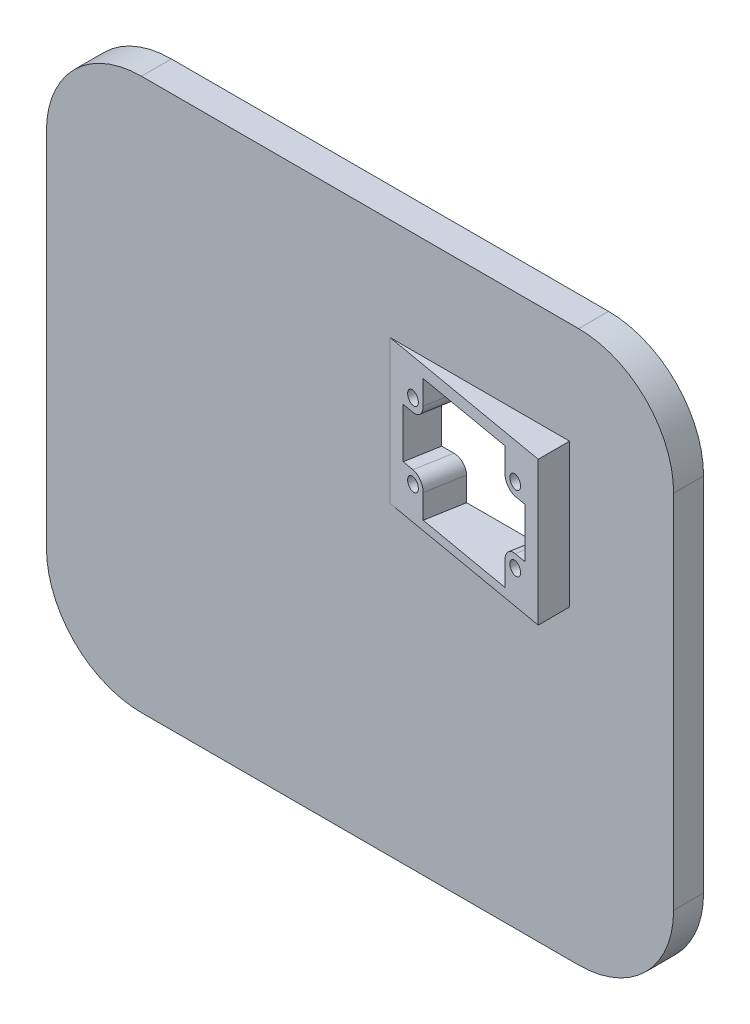
ISO-10303-21;
HEADER;
FILE_DESCRIPTION(('STEP AP214'),'2;1');
FILE_NAME('part.step','',(''),(''),'','','');
FILE_SCHEMA(('AUTOMOTIVE_DESIGN { 1 0 10303 214 1 1 1 1 }'));
ENDSEC;
DATA;
#1=APPLICATION_CONTEXT('core data for automotive mechanical design processes');
#2=APPLICATION_PROTOCOL_DEFINITION('international standard','automotive_design',2000,#1);
#3=PRODUCT_CONTEXT('',#1,'mechanical');
#4=PRODUCT('Part','Part','',(#3));
#5=PRODUCT_RELATED_PRODUCT_CATEGORY('part','',(#4));
#6=PRODUCT_DEFINITION_FORMATION('','',#4);
#7=PRODUCT_DEFINITION_CONTEXT('part definition',#1,'design');
#8=PRODUCT_DEFINITION('design','',#6,#7);
#9=PRODUCT_DEFINITION_SHAPE('','',#8);
#10=(LENGTH_UNIT() NAMED_UNIT(*) SI_UNIT(.MILLI.,.METRE.));
#11=(NAMED_UNIT(*) PLANE_ANGLE_UNIT() SI_UNIT($,.RADIAN.));
#12=(NAMED_UNIT(*) SI_UNIT($,.STERADIAN.) SOLID_ANGLE_UNIT());
#13=UNCERTAINTY_MEASURE_WITH_UNIT(LENGTH_MEASURE(1.E-05),#10,'distance_accuracy_value','');
#14=(GEOMETRIC_REPRESENTATION_CONTEXT(3) GLOBAL_UNCERTAINTY_ASSIGNED_CONTEXT((#13)) GLOBAL_UNIT_ASSIGNED_CONTEXT((#10,
#11,#12)) REPRESENTATION_CONTEXT('',''));
#15=CARTESIAN_POINT('',(0.,0.,0.));
#16=DIRECTION('',(0.,0.,1.));
#17=DIRECTION('',(1.,0.,0.));
#18=AXIS2_PLACEMENT_3D('',#15,#16,#17);
#19=CARTESIAN_POINT('',(-36.5125,30.1625,0.));
#20=DIRECTION('',(0.,0.,1.));
#21=DIRECTION('',(1.,0.,0.));
#22=AXIS2_PLACEMENT_3D('',#19,#20,#21);
#23=PLANE('',#22);
#24=CARTESIAN_POINT('',(31.987168446158,10.5,0.));
#25=DIRECTION('',(0.,0.,1.));
#26=DIRECTION('',(-1.,0.,0.));
#27=AXIS2_PLACEMENT_3D('',#24,#25,#26);
#28=ELLIPSE('',#27,1.1166102666244,1.1);
#29=CARTESIAN_POINT('',(30.8705581795336,10.5,0.));
#30=VERTEX_POINT('',#29);
#31=EDGE_CURVE('E408',#30,#30,#28,.T.);
#32=ORIENTED_EDGE('',*,*,#31,.T.);
#33=EDGE_LOOP('',(#32));
#34=FACE_BOUND('',#33,.T.);
#35=CARTESIAN_POINT('',(10.6700633560558,23.,0.));
#36=DIRECTION('',(0.,0.,1.));
#37=DIRECTION('',(-1.,0.,0.));
#38=AXIS2_PLACEMENT_3D('',#35,#36,#37);
#39=ELLIPSE('',#38,1.1166102666244,1.1);
#40=CARTESIAN_POINT('',(9.55345308943141,23.,0.));
#41=VERTEX_POINT('',#40);
#42=EDGE_CURVE('E400',#41,#41,#39,.T.);
#43=ORIENTED_EDGE('',*,*,#42,.T.);
#44=EDGE_LOOP('',(#43));
#45=FACE_BOUND('',#44,.T.);
#46=CARTESIAN_POINT('',(-36.5125,30.1625,0.));
#47=DIRECTION('',(0.,0.,1.));
#48=DIRECTION('',(1.,0.,0.));
#49=AXIS2_PLACEMENT_3D('',#46,#47,#48);
#50=CIRCLE('',#49,15.875);
#51=CARTESIAN_POINT('',(-36.5125,46.0375,0.));
#52=VERTEX_POINT('',#51);
#53=CARTESIAN_POINT('',(-52.3875,30.1625,0.));
#54=VERTEX_POINT('',#53);
#55=EDGE_CURVE('E448',#52,#54,#50,.T.);
#56=ORIENTED_EDGE('',*,*,#55,.F.);
#57=DIRECTION('',(-1.,0.,0.));
#58=VECTOR('',#57,1.);
#59=CARTESIAN_POINT('',(-36.5125,46.0375,0.));
#60=LINE('',#59,#58);
#61=CARTESIAN_POINT('',(36.5125,46.0375,0.));
#62=VERTEX_POINT('',#61);
#63=EDGE_CURVE('E454',#62,#52,#60,.T.);
#64=ORIENTED_EDGE('',*,*,#63,.F.);
#65=CARTESIAN_POINT('',(36.5125,30.1625,0.));
#66=DIRECTION('',(0.,0.,1.));
#67=DIRECTION('',(-1.,0.,0.));
#68=AXIS2_PLACEMENT_3D('',#65,#66,#67);
#69=CIRCLE('',#68,15.875);
#70=CARTESIAN_POINT('',(52.3875,30.1625,0.));
#71=VERTEX_POINT('',#70);
#72=EDGE_CURVE('E494',#71,#62,#69,.T.);
#73=ORIENTED_EDGE('',*,*,#72,.F.);
#74=DIRECTION('',(0.,1.,0.));
#75=VECTOR('',#74,1.);
#76=CARTESIAN_POINT('',(52.3875,30.1625,0.));
#77=LINE('',#76,#75);
#78=CARTESIAN_POINT('',(52.3875,-30.1625,0.));
#79=VERTEX_POINT('',#78);
#80=EDGE_CURVE('E491',#79,#71,#77,.T.);
#81=ORIENTED_EDGE('',*,*,#80,.F.);
#82=CARTESIAN_POINT('',(36.5125,-30.1625,0.));
#83=DIRECTION('',(0.,0.,1.));
#84=DIRECTION('',(1.,0.,0.));
#85=AXIS2_PLACEMENT_3D('',#82,#83,#84);
#86=CIRCLE('',#85,15.875);
#87=CARTESIAN_POINT('',(36.5125,-46.0375,0.));
#88=VERTEX_POINT('',#87);
#89=EDGE_CURVE('E488',#88,#79,#86,.T.);
#90=ORIENTED_EDGE('',*,*,#89,.F.);
#91=DIRECTION('',(1.,0.,0.));
#92=VECTOR('',#91,1.);
#93=CARTESIAN_POINT('',(-36.5125,-46.0375,0.));
#94=LINE('',#93,#92);
#95=CARTESIAN_POINT('',(-36.5125,-46.0375,0.));
#96=VERTEX_POINT('',#95);
#97=EDGE_CURVE('E485',#96,#88,#94,.T.);
#98=ORIENTED_EDGE('',*,*,#97,.F.);
#99=CARTESIAN_POINT('',(-36.5125,-30.1625,0.));
#100=DIRECTION('',(0.,0.,1.));
#101=DIRECTION('',(-1.,0.,0.));
#102=AXIS2_PLACEMENT_3D('',#99,#100,#101);
#103=CIRCLE('',#102,15.875);
#104=CARTESIAN_POINT('',(-52.3875,-30.1625,0.));
#105=VERTEX_POINT('',#104);
#106=EDGE_CURVE('E482',#105,#96,#103,.T.);
#107=ORIENTED_EDGE('',*,*,#106,.F.);
#108=DIRECTION('',(0.,-1.,0.));
#109=VECTOR('',#108,1.);
#110=CARTESIAN_POINT('',(-52.3875,30.1625,0.));
#111=LINE('',#110,#109);
#112=EDGE_CURVE('E479',#54,#105,#111,.T.);
#113=ORIENTED_EDGE('',*,*,#112,.F.);
#114=EDGE_LOOP('',(#56,#64,#73,#81,#90,#98,#107,#113));
#115=FACE_BOUND('',#114,.T.);
#116=DIRECTION('',(-1.,0.,0.));
#117=VECTOR('',#116,1.);
#118=CARTESIAN_POINT('',(-36.5125,27.,0.));
#119=LINE('',#118,#117);
#120=CARTESIAN_POINT('',(29.8554579371477,27.,0.));
#121=VERTEX_POINT('',#120);
#122=CARTESIAN_POINT('',(12.801773865066,27.,0.));
#123=VERTEX_POINT('',#122);
#124=EDGE_CURVE('E392',#121,#123,#119,.T.);
#125=ORIENTED_EDGE('',*,*,#124,.T.);
#126=DIRECTION('',(0.,-1.,0.));
#127=VECTOR('',#126,1.);
#128=CARTESIAN_POINT('',(12.801773865066,30.1625,0.));
#129=LINE('',#128,#127);
#130=CARTESIAN_POINT('',(12.801773865066,23.,0.));
#131=VERTEX_POINT('',#130);
#132=EDGE_CURVE('E396',#123,#131,#129,.T.);
#133=ORIENTED_EDGE('',*,*,#132,.T.);
#134=CARTESIAN_POINT('',(10.6700633560558,23.,0.));
#135=DIRECTION('',(0.,0.,1.));
#136=DIRECTION('',(-1.,0.,0.));
#137=AXIS2_PLACEMENT_3D('',#134,#135,#136);
#138=ELLIPSE('',#137,2.13171050901021,2.1);
#139=CARTESIAN_POINT('',(10.6700633560558,20.9,0.));
#140=VERTEX_POINT('',#139);
#141=EDGE_CURVE('E299',#131,#140,#138,.F.);
#142=ORIENTED_EDGE('',*,*,#141,.T.);
#143=DIRECTION('',(-1.,0.,0.));
#144=VECTOR('',#143,1.);
#145=CARTESIAN_POINT('',(-36.5125,20.8999999999998,0.));
#146=LINE('',#145,#144);
#147=CARTESIAN_POINT('',(8.63986287128418,20.9,0.));
#148=VERTEX_POINT('',#147);
#149=EDGE_CURVE('E225',#140,#148,#146,.T.);
#150=ORIENTED_EDGE('',*,*,#149,.T.);
#151=DIRECTION('',(0.,-1.,0.));
#152=VECTOR('',#151,1.);
#153=CARTESIAN_POINT('',(8.63986287128418,30.1625,0.));
#154=LINE('',#153,#152);
#155=CARTESIAN_POINT('',(8.63986287128417,12.6,0.));
#156=VERTEX_POINT('',#155);
#157=EDGE_CURVE('E344',#148,#156,#154,.T.);
#158=ORIENTED_EDGE('',*,*,#157,.T.);
#159=DIRECTION('',(1.,0.,0.));
#160=VECTOR('',#159,1.);
#161=CARTESIAN_POINT('',(-36.5125,12.6000000000001,0.));
#162=LINE('',#161,#160);
#163=CARTESIAN_POINT('',(10.6700633560558,12.6,0.));
#164=VERTEX_POINT('',#163);
#165=EDGE_CURVE('E348',#156,#164,#162,.T.);
#166=ORIENTED_EDGE('',*,*,#165,.T.);
#167=CARTESIAN_POINT('',(10.6700633560558,10.5,0.));
#168=DIRECTION('',(0.,0.,1.));
#169=DIRECTION('',(-1.,0.,0.));
#170=AXIS2_PLACEMENT_3D('',#167,#168,#169);
#171=ELLIPSE('',#170,2.13171050901021,2.1);
#172=CARTESIAN_POINT('',(12.801773865066,10.5,0.));
#173=VERTEX_POINT('',#172);
#174=EDGE_CURVE('E352',#164,#173,#171,.F.);
#175=ORIENTED_EDGE('',*,*,#174,.T.);
#176=DIRECTION('',(0.,-1.,0.));
#177=VECTOR('',#176,1.);
#178=CARTESIAN_POINT('',(12.801773865066,30.1625,0.));
#179=LINE('',#178,#177);
#180=CARTESIAN_POINT('',(12.801773865066,6.5,0.));
#181=VERTEX_POINT('',#180);
#182=EDGE_CURVE('E356',#173,#181,#179,.T.);
#183=ORIENTED_EDGE('',*,*,#182,.T.);
#184=DIRECTION('',(1.,0.,0.));
#185=VECTOR('',#184,1.);
#186=CARTESIAN_POINT('',(-36.5125,6.49999999999999,0.));
#187=LINE('',#186,#185);
#188=CARTESIAN_POINT('',(29.8554579371477,6.5,0.));
#189=VERTEX_POINT('',#188);
#190=EDGE_CURVE('E360',#181,#189,#187,.T.);
#191=ORIENTED_EDGE('',*,*,#190,.T.);
#192=DIRECTION('',(0.,1.,0.));
#193=VECTOR('',#192,1.);
#194=CARTESIAN_POINT('',(29.8554579371477,30.1625,0.));
#195=LINE('',#194,#193);
#196=CARTESIAN_POINT('',(29.8554579371477,10.5,0.));
#197=VERTEX_POINT('',#196);
#198=EDGE_CURVE('E364',#189,#197,#195,.T.);
#199=ORIENTED_EDGE('',*,*,#198,.T.);
#200=CARTESIAN_POINT('',(31.987168446158,10.5,0.));
#201=DIRECTION('',(0.,0.,1.));
#202=DIRECTION('',(-1.,0.,0.));
#203=AXIS2_PLACEMENT_3D('',#200,#201,#202);
#204=ELLIPSE('',#203,2.13171050901021,2.1);
#205=CARTESIAN_POINT('',(31.987168446158,12.6,0.));
#206=VERTEX_POINT('',#205);
#207=EDGE_CURVE('E368',#197,#206,#204,.F.);
#208=ORIENTED_EDGE('',*,*,#207,.T.);
#209=DIRECTION('',(1.,0.,0.));
#210=VECTOR('',#209,1.);
#211=CARTESIAN_POINT('',(-36.5124999999999,12.5999999999998,0.));
#212=LINE('',#211,#210);
#213=CARTESIAN_POINT('',(34.0173689309296,12.6,0.));
#214=VERTEX_POINT('',#213);
#215=EDGE_CURVE('E372',#206,#214,#212,.T.);
#216=ORIENTED_EDGE('',*,*,#215,.T.);
#217=DIRECTION('',(0.,1.,0.));
#218=VECTOR('',#217,1.);
#219=CARTESIAN_POINT('',(34.0173689309296,30.1625,0.));
#220=LINE('',#219,#218);
#221=CARTESIAN_POINT('',(34.0173689309296,20.9,0.));
#222=VERTEX_POINT('',#221);
#223=EDGE_CURVE('E376',#214,#222,#220,.T.);
#224=ORIENTED_EDGE('',*,*,#223,.T.);
#225=DIRECTION('',(-1.,0.,0.));
#226=VECTOR('',#225,1.);
#227=CARTESIAN_POINT('',(-36.5125,20.9000000000002,0.));
#228=LINE('',#227,#226);
#229=CARTESIAN_POINT('',(31.987168446158,20.9,0.));
#230=VERTEX_POINT('',#229);
#231=EDGE_CURVE('E380',#222,#230,#228,.T.);
#232=ORIENTED_EDGE('',*,*,#231,.T.);
#233=CARTESIAN_POINT('',(31.987168446158,23.,0.));
#234=DIRECTION('',(0.,0.,1.));
#235=DIRECTION('',(-1.,0.,0.));
#236=AXIS2_PLACEMENT_3D('',#233,#234,#235);
#237=ELLIPSE('',#236,2.13171050901021,2.1);
#238=CARTESIAN_POINT('',(29.8554579371477,23.,0.));
#239=VERTEX_POINT('',#238);
#240=EDGE_CURVE('E384',#230,#239,#237,.F.);
#241=ORIENTED_EDGE('',*,*,#240,.T.);
#242=DIRECTION('',(0.,1.,0.));
#243=VECTOR('',#242,1.);
#244=CARTESIAN_POINT('',(29.8554579371477,30.1625,0.));
#245=LINE('',#244,#243);
#246=EDGE_CURVE('E388',#239,#121,#245,.T.);
#247=ORIENTED_EDGE('',*,*,#246,.T.);
#248=EDGE_LOOP('',(#125,#133,#142,#150,#158,#166,#175,#183,#191,#199,#208,#216,#224,#232,#241,#247));
#249=FACE_BOUND('',#248,.T.);
#250=CARTESIAN_POINT('',(31.987168446158,23.,0.));
#251=DIRECTION('',(0.,0.,1.));
#252=DIRECTION('',(-1.,0.,0.));
#253=AXIS2_PLACEMENT_3D('',#250,#251,#252);
#254=ELLIPSE('',#253,1.1166102666244,1.1);
#255=CARTESIAN_POINT('',(30.8705581795336,23.,0.));
#256=VERTEX_POINT('',#255);
#257=EDGE_CURVE('E404',#256,#256,#254,.T.);
#258=ORIENTED_EDGE('',*,*,#257,.T.);
#259=EDGE_LOOP('',(#258));
#260=FACE_BOUND('',#259,.T.);
#261=CARTESIAN_POINT('',(10.6700633560558,10.5,0.));
#262=DIRECTION('',(0.,0.,1.));
#263=DIRECTION('',(-1.,0.,0.));
#264=AXIS2_PLACEMENT_3D('',#261,#262,#263);
#265=ELLIPSE('',#264,1.1166102666244,1.1);
#266=CARTESIAN_POINT('',(9.55345308943141,10.5,0.));
#267=VERTEX_POINT('',#266);
#268=EDGE_CURVE('E412',#267,#267,#265,.T.);
#269=ORIENTED_EDGE('',*,*,#268,.T.);
#270=EDGE_LOOP('',(#269));
#271=FACE_BOUND('',#270,.T.);
#272=ADVANCED_FACE('F39',(#34,#45,#115,#249,#260,#271),#23,.F.);
#273=CARTESIAN_POINT('',(4.99999999999998,29.,5.));
#274=DIRECTION('',(0.171842805924432,0.,-0.985124383035979));
#275=DIRECTION('',(-0.985124383035979,0.,-0.171842805924432));
#276=AXIS2_PLACEMENT_3D('',#273,#274,#275);
#277=PLANE('',#276);
#278=CARTESIAN_POINT('',(30.3438060218778,10.5,9.42091457139877));
#279=DIRECTION('',(-0.171842805924432,0.,0.985124383035979));
#280=DIRECTION('',(0.985124383035979,0.,0.171842805924432));
#281=AXIS2_PLACEMENT_3D('',#278,#279,#280);
#282=CIRCLE('',#281,1.1);
#283=CARTESIAN_POINT('',(31.4274428432173,10.5,9.60994165791565));
#284=VERTEX_POINT('',#283);
#285=EDGE_CURVE('E690',#284,#284,#282,.T.);
#286=ORIENTED_EDGE('',*,*,#285,.F.);
#287=EDGE_LOOP('',(#286));
#288=FACE_BOUND('',#287,.T.);
#289=CARTESIAN_POINT('',(9.65619397812221,23.,5.81221564698571));
#290=DIRECTION('',(-0.171842805924432,0.,0.985124383035979));
#291=DIRECTION('',(0.985124383035979,0.,0.171842805924432));
#292=AXIS2_PLACEMENT_3D('',#289,#290,#291);
#293=CIRCLE('',#292,1.1);
#294=CARTESIAN_POINT('',(10.7398307994618,23.,6.00124273350259));
#295=VERTEX_POINT('',#294);
#296=EDGE_CURVE('E681',#295,#295,#293,.T.);
#297=ORIENTED_EDGE('',*,*,#296,.F.);
#298=EDGE_LOOP('',(#297));
#299=FACE_BOUND('',#298,.T.);
#300=DIRECTION('',(0.985124383035979,0.,0.171842805924432));
#301=VECTOR('',#300,1.);
#302=CARTESIAN_POINT('',(4.99999999999998,5.,5.));
#303=LINE('',#302,#301);
#304=CARTESIAN_POINT('',(4.99999999999998,5.,5.));
#305=VERTEX_POINT('',#304);
#306=CARTESIAN_POINT('',(35.,5.,10.2331302183845));
#307=VERTEX_POINT('',#306);
#308=EDGE_CURVE('E432',#305,#307,#303,.T.);
#309=ORIENTED_EDGE('',*,*,#308,.T.);
#310=DIRECTION('',(0.,-1.,0.));
#311=VECTOR('',#310,1.);
#312=CARTESIAN_POINT('',(35.,29.,10.2331302183845));
#313=LINE('',#312,#311);
#314=CARTESIAN_POINT('',(35.,29.,10.2331302183845));
#315=VERTEX_POINT('',#314);
#316=EDGE_CURVE('E440',#315,#307,#313,.T.);
#317=ORIENTED_EDGE('',*,*,#316,.F.);
#318=DIRECTION('',(0.985124383035979,0.,0.171842805924432));
#319=VECTOR('',#318,1.);
#320=CARTESIAN_POINT('',(4.99999999999998,29.,5.));
#321=LINE('',#320,#319);
#322=CARTESIAN_POINT('',(4.99999999999998,29.,5.));
#323=VERTEX_POINT('',#322);
#324=EDGE_CURVE('E421',#323,#315,#321,.T.);
#325=ORIENTED_EDGE('',*,*,#324,.F.);
#326=DIRECTION('',(0.,-1.,0.));
#327=VECTOR('',#326,1.);
#328=CARTESIAN_POINT('',(4.99999999999998,29.,5.));
#329=LINE('',#328,#327);
#330=EDGE_CURVE('E444',#323,#305,#329,.T.);
#331=ORIENTED_EDGE('',*,*,#330,.T.);
#332=EDGE_LOOP('',(#309,#317,#325,#331));
#333=FACE_BOUND('',#332,.T.);
#334=CARTESIAN_POINT('',(9.65619397812221,23.,5.81221564698571));
#335=DIRECTION('',(0.171842805924432,0.,-0.985124383035979));
#336=DIRECTION('',(0.985124383035979,0.,0.171842805924432));
#337=AXIS2_PLACEMENT_3D('',#334,#335,#336);
#338=CIRCLE('',#337,2.1);
#339=CARTESIAN_POINT('',(11.7249551824978,23.,6.17308553942701));
#340=VERTEX_POINT('',#339);
#341=CARTESIAN_POINT('',(9.65619397812221,20.9,5.81221564698571));
#342=VERTEX_POINT('',#341);
#343=EDGE_CURVE('E232',#340,#342,#338,.T.);
#344=ORIENTED_EDGE('',*,*,#343,.F.);
#345=DIRECTION('',(0.,-1.,0.));
#346=VECTOR('',#345,1.);
#347=CARTESIAN_POINT('',(11.7249551824978,27.,6.17308553942702));
#348=LINE('',#347,#346);
#349=CARTESIAN_POINT('',(11.7249551824978,27.,6.17308553942702));
#350=VERTEX_POINT('',#349);
#351=EDGE_CURVE('E63',#350,#340,#348,.T.);
#352=ORIENTED_EDGE('',*,*,#351,.F.);
#353=DIRECTION('',(-0.985124383035979,0.,-0.171842805924431));
#354=VECTOR('',#353,1.);
#355=CARTESIAN_POINT('',(28.2750448175022,27.,9.06004467895747));
#356=LINE('',#355,#354);
#357=CARTESIAN_POINT('',(28.2750448175022,27.,9.06004467895747));
#358=VERTEX_POINT('',#357);
#359=EDGE_CURVE('E292',#358,#350,#356,.T.);
#360=ORIENTED_EDGE('',*,*,#359,.F.);
#361=DIRECTION('',(0.,1.,0.));
#362=VECTOR('',#361,1.);
#363=CARTESIAN_POINT('',(28.2750448175022,27.,9.06004467895747));
#364=LINE('',#363,#362);
#365=CARTESIAN_POINT('',(28.2750448175022,23.,9.06004467895747));
#366=VERTEX_POINT('',#365);
#367=EDGE_CURVE('E288',#366,#358,#364,.T.);
#368=ORIENTED_EDGE('',*,*,#367,.F.);
#369=CARTESIAN_POINT('',(30.3438060218778,23.,9.42091457139877));
#370=DIRECTION('',(0.171842805924432,0.,-0.985124383035979));
#371=DIRECTION('',(-0.985124383035979,0.,-0.171842805924432));
#372=AXIS2_PLACEMENT_3D('',#369,#370,#371);
#373=CIRCLE('',#372,2.1);
#374=CARTESIAN_POINT('',(30.3438060218778,20.9,9.42091457139878));
#375=VERTEX_POINT('',#374);
#376=EDGE_CURVE('E284',#375,#366,#373,.T.);
#377=ORIENTED_EDGE('',*,*,#376,.F.);
#378=DIRECTION('',(-0.985124383035979,0.,-0.171842805924432));
#379=VECTOR('',#378,1.);
#380=CARTESIAN_POINT('',(32.3140547879497,20.9,9.76460018324764));
#381=LINE('',#380,#379);
#382=CARTESIAN_POINT('',(32.3140547879497,20.9,9.76460018324764));
#383=VERTEX_POINT('',#382);
#384=EDGE_CURVE('E280',#383,#375,#381,.T.);
#385=ORIENTED_EDGE('',*,*,#384,.F.);
#386=DIRECTION('',(0.,1.,0.));
#387=VECTOR('',#386,1.);
#388=CARTESIAN_POINT('',(32.3140547879497,20.9,9.76460018324764));
#389=LINE('',#388,#387);
#390=CARTESIAN_POINT('',(32.3140547879497,12.6,9.76460018324764));
#391=VERTEX_POINT('',#390);
#392=EDGE_CURVE('E276',#391,#383,#389,.T.);
#393=ORIENTED_EDGE('',*,*,#392,.F.);
#394=DIRECTION('',(0.985124383035979,0.,0.171842805924432));
#395=VECTOR('',#394,1.);
#396=CARTESIAN_POINT('',(32.3140547879497,12.6,9.76460018324764));
#397=LINE('',#396,#395);
#398=CARTESIAN_POINT('',(30.3438060218778,12.6,9.42091457139878));
#399=VERTEX_POINT('',#398);
#400=EDGE_CURVE('E272',#399,#391,#397,.T.);
#401=ORIENTED_EDGE('',*,*,#400,.F.);
#402=CARTESIAN_POINT('',(30.3438060218778,10.5,9.42091457139877));
#403=DIRECTION('',(0.171842805924432,0.,-0.985124383035979));
#404=DIRECTION('',(0.985124383035979,0.,0.171842805924432));
#405=AXIS2_PLACEMENT_3D('',#402,#403,#404);
#406=CIRCLE('',#405,2.1);
#407=CARTESIAN_POINT('',(28.2750448175022,10.5,9.06004467895747));
#408=VERTEX_POINT('',#407);
#409=EDGE_CURVE('E268',#408,#399,#406,.T.);
#410=ORIENTED_EDGE('',*,*,#409,.F.);
#411=DIRECTION('',(0.,1.,0.));
#412=VECTOR('',#411,1.);
#413=CARTESIAN_POINT('',(28.2750448175022,6.5,9.06004467895747));
#414=LINE('',#413,#412);
#415=CARTESIAN_POINT('',(28.2750448175022,6.5,9.06004467895747));
#416=VERTEX_POINT('',#415);
#417=EDGE_CURVE('E264',#416,#408,#414,.T.);
#418=ORIENTED_EDGE('',*,*,#417,.F.);
#419=DIRECTION('',(0.985124383035979,0.,0.171842805924432));
#420=VECTOR('',#419,1.);
#421=CARTESIAN_POINT('',(28.2750448175022,6.5,9.06004467895747));
#422=LINE('',#421,#420);
#423=CARTESIAN_POINT('',(11.7249551824978,6.5,6.17308553942702));
#424=VERTEX_POINT('',#423);
#425=EDGE_CURVE('E260',#424,#416,#422,.T.);
#426=ORIENTED_EDGE('',*,*,#425,.F.);
#427=DIRECTION('',(0.,-1.,0.));
#428=VECTOR('',#427,1.);
#429=CARTESIAN_POINT('',(11.7249551824978,6.5,6.17308553942702));
#430=LINE('',#429,#428);
#431=CARTESIAN_POINT('',(11.7249551824978,10.5,6.17308553942702));
#432=VERTEX_POINT('',#431);
#433=EDGE_CURVE('E256',#432,#424,#430,.T.);
#434=ORIENTED_EDGE('',*,*,#433,.F.);
#435=CARTESIAN_POINT('',(9.65619397812221,10.5,5.81221564698571));
#436=DIRECTION('',(0.171842805924432,0.,-0.985124383035979));
#437=DIRECTION('',(-0.985124383035979,0.,-0.171842805924432));
#438=AXIS2_PLACEMENT_3D('',#435,#436,#437);
#439=CIRCLE('',#438,2.1);
#440=CARTESIAN_POINT('',(9.65619397812221,12.6,5.81221564698571));
#441=VERTEX_POINT('',#440);
#442=EDGE_CURVE('E252',#441,#432,#439,.T.);
#443=ORIENTED_EDGE('',*,*,#442,.F.);
#444=DIRECTION('',(0.985124383035979,0.,0.171842805924432));
#445=VECTOR('',#444,1.);
#446=CARTESIAN_POINT('',(7.68594521205025,12.6,5.46853003513685));
#447=LINE('',#446,#445);
#448=CARTESIAN_POINT('',(7.68594521205025,12.6,5.46853003513685));
#449=VERTEX_POINT('',#448);
#450=EDGE_CURVE('E245',#449,#441,#447,.T.);
#451=ORIENTED_EDGE('',*,*,#450,.F.);
#452=DIRECTION('',(0.,-1.,0.));
#453=VECTOR('',#452,1.);
#454=CARTESIAN_POINT('',(7.68594521205025,20.9,5.46853003513685));
#455=LINE('',#454,#453);
#456=CARTESIAN_POINT('',(7.68594521205025,20.9,5.46853003513685));
#457=VERTEX_POINT('',#456);
#458=EDGE_CURVE('E241',#457,#449,#455,.T.);
#459=ORIENTED_EDGE('',*,*,#458,.F.);
#460=DIRECTION('',(-0.985124383035979,0.,-0.171842805924431));
#461=VECTOR('',#460,1.);
#462=CARTESIAN_POINT('',(7.68594521205025,20.9,5.46853003513685));
#463=LINE('',#462,#461);
#464=EDGE_CURVE('E222',#342,#457,#463,.T.);
#465=ORIENTED_EDGE('',*,*,#464,.F.);
#466=EDGE_LOOP('',(#344,#352,#360,#368,#377,#385,#393,#401,#410,#418,#426,#434,#443,#451,#459,#465));
#467=FACE_BOUND('',#466,.T.);
#468=CARTESIAN_POINT('',(30.3438060218778,23.,9.42091457139877));
#469=DIRECTION('',(-0.171842805924432,0.,0.985124383035979));
#470=DIRECTION('',(-0.985124383035979,0.,-0.171842805924432));
#471=AXIS2_PLACEMENT_3D('',#468,#469,#470);
#472=CIRCLE('',#471,1.1);
#473=CARTESIAN_POINT('',(29.2601692005382,23.,9.2318874848819));
#474=VERTEX_POINT('',#473);
#475=EDGE_CURVE('E685',#474,#474,#472,.T.);
#476=ORIENTED_EDGE('',*,*,#475,.F.);
#477=EDGE_LOOP('',(#476));
#478=FACE_BOUND('',#477,.T.);
#479=CARTESIAN_POINT('',(9.65619397812221,10.5,5.81221564698571));
#480=DIRECTION('',(-0.171842805924432,0.,0.985124383035979));
#481=DIRECTION('',(-0.985124383035979,0.,-0.171842805924432));
#482=AXIS2_PLACEMENT_3D('',#479,#480,#481);
#483=CIRCLE('',#482,1.1);
#484=CARTESIAN_POINT('',(8.57255715678263,10.5,5.62318856046884));
#485=VERTEX_POINT('',#484);
#486=EDGE_CURVE('E696',#485,#485,#483,.T.);
#487=ORIENTED_EDGE('',*,*,#486,.F.);
#488=EDGE_LOOP('',(#487));
#489=FACE_BOUND('',#488,.T.);
#490=ADVANCED_FACE('F237',(#288,#299,#333,#467,#478,#489),#277,.F.);
#491=CARTESIAN_POINT('',(-36.5125,30.1625,5.));
#492=DIRECTION('',(0.,0.,1.));
#493=DIRECTION('',(1.,0.,0.));
#494=AXIS2_PLACEMENT_3D('',#491,#492,#493);
#495=PLANE('',#494);
#496=CARTESIAN_POINT('',(-36.5125,30.1625,5.));
#497=DIRECTION('',(0.,0.,1.));
#498=DIRECTION('',(1.,0.,0.));
#499=AXIS2_PLACEMENT_3D('',#496,#497,#498);
#500=CIRCLE('',#499,15.875);
#501=CARTESIAN_POINT('',(-36.5125,46.0375,5.));
#502=VERTEX_POINT('',#501);
#503=CARTESIAN_POINT('',(-52.3875,30.1625,5.));
#504=VERTEX_POINT('',#503);
#505=EDGE_CURVE('E449',#502,#504,#500,.T.);
#506=ORIENTED_EDGE('',*,*,#505,.T.);
#507=DIRECTION('',(0.,-1.,0.));
#508=VECTOR('',#507,1.);
#509=CARTESIAN_POINT('',(-52.3875,30.1625,5.));
#510=LINE('',#509,#508);
#511=CARTESIAN_POINT('',(-52.3875,-30.1625,5.));
#512=VERTEX_POINT('',#511);
#513=EDGE_CURVE('E453',#504,#512,#510,.T.);
#514=ORIENTED_EDGE('',*,*,#513,.T.);
#515=CARTESIAN_POINT('',(-36.5125,-30.1625,5.));
#516=DIRECTION('',(0.,0.,1.));
#517=DIRECTION('',(-1.,0.,0.));
#518=AXIS2_PLACEMENT_3D('',#515,#516,#517);
#519=CIRCLE('',#518,15.875);
#520=CARTESIAN_POINT('',(-36.5125,-46.0375,5.));
#521=VERTEX_POINT('',#520);
#522=EDGE_CURVE('E457',#512,#521,#519,.T.);
#523=ORIENTED_EDGE('',*,*,#522,.T.);
#524=DIRECTION('',(1.,0.,0.));
#525=VECTOR('',#524,1.);
#526=CARTESIAN_POINT('',(-36.5125,-46.0375,5.));
#527=LINE('',#526,#525);
#528=CARTESIAN_POINT('',(36.5125,-46.0375,5.));
#529=VERTEX_POINT('',#528);
#530=EDGE_CURVE('E460',#521,#529,#527,.T.);
#531=ORIENTED_EDGE('',*,*,#530,.T.);
#532=CARTESIAN_POINT('',(36.5125,-30.1625,5.));
#533=DIRECTION('',(0.,0.,1.));
#534=DIRECTION('',(1.,0.,0.));
#535=AXIS2_PLACEMENT_3D('',#532,#533,#534);
#536=CIRCLE('',#535,15.875);
#537=CARTESIAN_POINT('',(52.3875,-30.1625,5.));
#538=VERTEX_POINT('',#537);
#539=EDGE_CURVE('E463',#529,#538,#536,.T.);
#540=ORIENTED_EDGE('',*,*,#539,.T.);
#541=DIRECTION('',(0.,1.,0.));
#542=VECTOR('',#541,1.);
#543=CARTESIAN_POINT('',(52.3875,30.1625,5.));
#544=LINE('',#543,#542);
#545=CARTESIAN_POINT('',(52.3875,30.1625,5.));
#546=VERTEX_POINT('',#545);
#547=EDGE_CURVE('E466',#538,#546,#544,.T.);
#548=ORIENTED_EDGE('',*,*,#547,.T.);
#549=CARTESIAN_POINT('',(36.5125,30.1625,5.));
#550=DIRECTION('',(0.,0.,1.));
#551=DIRECTION('',(-1.,0.,0.));
#552=AXIS2_PLACEMENT_3D('',#549,#550,#551);
#553=CIRCLE('',#552,15.875);
#554=CARTESIAN_POINT('',(36.5125,46.0375,5.));
#555=VERTEX_POINT('',#554);
#556=EDGE_CURVE('E469',#546,#555,#553,.T.);
#557=ORIENTED_EDGE('',*,*,#556,.T.);
#558=DIRECTION('',(-1.,0.,0.));
#559=VECTOR('',#558,1.);
#560=CARTESIAN_POINT('',(-36.5125,46.0375,5.));
#561=LINE('',#560,#559);
#562=EDGE_CURVE('E472',#555,#502,#561,.T.);
#563=ORIENTED_EDGE('',*,*,#562,.T.);
#564=EDGE_LOOP('',(#506,#514,#523,#531,#540,#548,#557,#563));
#565=FACE_BOUND('',#564,.T.);
#566=ORIENTED_EDGE('',*,*,#330,.F.);
#567=DIRECTION('',(-1.,0.,0.));
#568=VECTOR('',#567,1.);
#569=CARTESIAN_POINT('',(35.,29.,5.));
#570=LINE('',#569,#568);
#571=CARTESIAN_POINT('',(35.,29.,5.));
#572=VERTEX_POINT('',#571);
#573=EDGE_CURVE('E417',#572,#323,#570,.T.);
#574=ORIENTED_EDGE('',*,*,#573,.F.);
#575=DIRECTION('',(0.,-1.,0.));
#576=VECTOR('',#575,1.);
#577=CARTESIAN_POINT('',(35.,29.,5.));
#578=LINE('',#577,#576);
#579=CARTESIAN_POINT('',(35.,5.,5.));
#580=VERTEX_POINT('',#579);
#581=EDGE_CURVE('E429',#572,#580,#578,.T.);
#582=ORIENTED_EDGE('',*,*,#581,.T.);
#583=DIRECTION('',(-1.,0.,0.));
#584=VECTOR('',#583,1.);
#585=CARTESIAN_POINT('',(35.,5.,5.));
#586=LINE('',#585,#584);
#587=EDGE_CURVE('E416',#580,#305,#586,.T.);
#588=ORIENTED_EDGE('',*,*,#587,.T.);
#589=EDGE_LOOP('',(#566,#574,#582,#588));
#590=FACE_BOUND('',#589,.T.);
#591=ADVANCED_FACE('F546',(#565,#590),#495,.T.);
#592=CARTESIAN_POINT('',(-36.5125,30.1625,5.));
#593=DIRECTION('',(0.,0.,-1.));
#594=DIRECTION('',(-1.,0.,0.));
#595=AXIS2_PLACEMENT_3D('',#592,#593,#594);
#596=CYLINDRICAL_SURFACE('',#595,15.875);
#597=ORIENTED_EDGE('',*,*,#55,.T.);
#598=DIRECTION('',(0.,0.,-1.));
#599=VECTOR('',#598,1.);
#600=CARTESIAN_POINT('',(-52.3875,30.1625,5.));
#601=LINE('',#600,#599);
#602=EDGE_CURVE('E11',#504,#54,#601,.T.);
#603=ORIENTED_EDGE('',*,*,#602,.F.);
#604=ORIENTED_EDGE('',*,*,#505,.F.);
#605=DIRECTION('',(0.,0.,-1.));
#606=VECTOR('',#605,1.);
#607=CARTESIAN_POINT('',(-36.5125,46.0375,5.));
#608=LINE('',#607,#606);
#609=EDGE_CURVE('E475',#502,#52,#608,.T.);
#610=ORIENTED_EDGE('',*,*,#609,.T.);
#611=EDGE_LOOP('',(#597,#603,#604,#610));
#612=FACE_BOUND('',#611,.T.);
#613=ADVANCED_FACE('F41',(#612),#596,.T.);
#614=CARTESIAN_POINT('',(-52.3875,30.1625,5.));
#615=DIRECTION('',(1.,0.,0.));
#616=DIRECTION('',(0.,1.,0.));
#617=AXIS2_PLACEMENT_3D('',#614,#615,#616);
#618=PLANE('',#617);
#619=ORIENTED_EDGE('',*,*,#112,.T.);
#620=DIRECTION('',(0.,0.,-1.));
#621=VECTOR('',#620,1.);
#622=CARTESIAN_POINT('',(-52.3875,-30.1625,5.));
#623=LINE('',#622,#621);
#624=EDGE_CURVE('E48',#512,#105,#623,.T.);
#625=ORIENTED_EDGE('',*,*,#624,.F.);
#626=ORIENTED_EDGE('',*,*,#513,.F.);
#627=ORIENTED_EDGE('',*,*,#602,.T.);
#628=EDGE_LOOP('',(#619,#625,#626,#627));
#629=FACE_BOUND('',#628,.T.);
#630=ADVANCED_FACE('F551',(#629),#618,.F.);
#631=CARTESIAN_POINT('',(-36.5125,-30.1625,5.));
#632=DIRECTION('',(0.,0.,-1.));
#633=DIRECTION('',(-1.,0.,0.));
#634=AXIS2_PLACEMENT_3D('',#631,#632,#633);
#635=CYLINDRICAL_SURFACE('',#634,15.875);
#636=ORIENTED_EDGE('',*,*,#106,.T.);
#637=DIRECTION('',(0.,0.,-1.));
#638=VECTOR('',#637,1.);
#639=CARTESIAN_POINT('',(-36.5125,-46.0375,5.));
#640=LINE('',#639,#638);
#641=EDGE_CURVE('E518',#521,#96,#640,.T.);
#642=ORIENTED_EDGE('',*,*,#641,.F.);
#643=ORIENTED_EDGE('',*,*,#522,.F.);
#644=ORIENTED_EDGE('',*,*,#624,.T.);
#645=EDGE_LOOP('',(#636,#642,#643,#644));
#646=FACE_BOUND('',#645,.T.);
#647=ADVANCED_FACE('F527',(#646),#635,.T.);
#648=CARTESIAN_POINT('',(-36.5125,-46.0375,5.));
#649=DIRECTION('',(0.,1.,0.));
#650=DIRECTION('',(-1.,0.,0.));
#651=AXIS2_PLACEMENT_3D('',#648,#649,#650);
#652=PLANE('',#651);
#653=ORIENTED_EDGE('',*,*,#97,.T.);
#654=DIRECTION('',(0.,0.,-1.));
#655=VECTOR('',#654,1.);
#656=CARTESIAN_POINT('',(36.5125,-46.0375,5.));
#657=LINE('',#656,#655);
#658=EDGE_CURVE('E514',#529,#88,#657,.T.);
#659=ORIENTED_EDGE('',*,*,#658,.F.);
#660=ORIENTED_EDGE('',*,*,#530,.F.);
#661=ORIENTED_EDGE('',*,*,#641,.T.);
#662=EDGE_LOOP('',(#653,#659,#660,#661));
#663=FACE_BOUND('',#662,.T.);
#664=ADVANCED_FACE('F538',(#663),#652,.F.);
#665=CARTESIAN_POINT('',(36.5125,-30.1625,5.));
#666=DIRECTION('',(0.,0.,-1.));
#667=DIRECTION('',(-1.,0.,0.));
#668=AXIS2_PLACEMENT_3D('',#665,#666,#667);
#669=CYLINDRICAL_SURFACE('',#668,15.875);
#670=ORIENTED_EDGE('',*,*,#89,.T.);
#671=DIRECTION('',(0.,0.,-1.));
#672=VECTOR('',#671,1.);
#673=CARTESIAN_POINT('',(52.3875,-30.1625,5.));
#674=LINE('',#673,#672);
#675=EDGE_CURVE('E510',#538,#79,#674,.T.);
#676=ORIENTED_EDGE('',*,*,#675,.F.);
#677=ORIENTED_EDGE('',*,*,#539,.F.);
#678=ORIENTED_EDGE('',*,*,#658,.T.);
#679=EDGE_LOOP('',(#670,#676,#677,#678));
#680=FACE_BOUND('',#679,.T.);
#681=ADVANCED_FACE('F542',(#680),#669,.T.);
#682=CARTESIAN_POINT('',(52.3875,30.1625,5.));
#683=DIRECTION('',(-1.,0.,0.));
#684=DIRECTION('',(0.,0.,1.));
#685=AXIS2_PLACEMENT_3D('',#682,#683,#684);
#686=PLANE('',#685);
#687=ORIENTED_EDGE('',*,*,#80,.T.);
#688=DIRECTION('',(0.,0.,-1.));
#689=VECTOR('',#688,1.);
#690=CARTESIAN_POINT('',(52.3875,30.1625,5.));
#691=LINE('',#690,#689);
#692=EDGE_CURVE('E506',#546,#71,#691,.T.);
#693=ORIENTED_EDGE('',*,*,#692,.F.);
#694=ORIENTED_EDGE('',*,*,#547,.F.);
#695=ORIENTED_EDGE('',*,*,#675,.T.);
#696=EDGE_LOOP('',(#687,#693,#694,#695));
#697=FACE_BOUND('',#696,.T.);
#698=ADVANCED_FACE('F564',(#697),#686,.F.);
#699=CARTESIAN_POINT('',(36.5125,30.1625,5.));
#700=DIRECTION('',(0.,0.,-1.));
#701=DIRECTION('',(-1.,0.,0.));
#702=AXIS2_PLACEMENT_3D('',#699,#700,#701);
#703=CYLINDRICAL_SURFACE('',#702,15.875);
#704=ORIENTED_EDGE('',*,*,#72,.T.);
#705=DIRECTION('',(0.,0.,-1.));
#706=VECTOR('',#705,1.);
#707=CARTESIAN_POINT('',(36.5125,46.0375,5.));
#708=LINE('',#707,#706);
#709=EDGE_CURVE('E502',#555,#62,#708,.T.);
#710=ORIENTED_EDGE('',*,*,#709,.F.);
#711=ORIENTED_EDGE('',*,*,#556,.F.);
#712=ORIENTED_EDGE('',*,*,#692,.T.);
#713=EDGE_LOOP('',(#704,#710,#711,#712));
#714=FACE_BOUND('',#713,.T.);
#715=ADVANCED_FACE('F562',(#714),#703,.T.);
#716=CARTESIAN_POINT('',(-36.5125,46.0375,5.));
#717=DIRECTION('',(0.,-1.,0.));
#718=DIRECTION('',(1.,0.,0.));
#719=AXIS2_PLACEMENT_3D('',#716,#717,#718);
#720=PLANE('',#719);
#721=ORIENTED_EDGE('',*,*,#63,.T.);
#722=ORIENTED_EDGE('',*,*,#609,.F.);
#723=ORIENTED_EDGE('',*,*,#562,.F.);
#724=ORIENTED_EDGE('',*,*,#709,.T.);
#725=EDGE_LOOP('',(#721,#722,#723,#724));
#726=FACE_BOUND('',#725,.T.);
#727=ADVANCED_FACE('F557',(#726),#720,.F.);
#728=CARTESIAN_POINT('',(35.,29.,10.2331302183845));
#729=DIRECTION('',(-1.,0.,0.));
#730=DIRECTION('',(0.,0.,1.));
#731=AXIS2_PLACEMENT_3D('',#728,#729,#730);
#732=PLANE('',#731);
#733=DIRECTION('',(0.,0.,-1.));
#734=VECTOR('',#733,1.);
#735=CARTESIAN_POINT('',(35.,5.,10.2331302183845));
#736=LINE('',#735,#734);
#737=EDGE_CURVE('E422',#307,#580,#736,.T.);
#738=ORIENTED_EDGE('',*,*,#737,.T.);
#739=ORIENTED_EDGE('',*,*,#581,.F.);
#740=DIRECTION('',(0.,0.,-1.));
#741=VECTOR('',#740,1.);
#742=CARTESIAN_POINT('',(35.,29.,10.2331302183845));
#743=LINE('',#742,#741);
#744=EDGE_CURVE('E425',#315,#572,#743,.T.);
#745=ORIENTED_EDGE('',*,*,#744,.F.);
#746=ORIENTED_EDGE('',*,*,#316,.T.);
#747=EDGE_LOOP('',(#738,#739,#745,#746));
#748=FACE_BOUND('',#747,.T.);
#749=ADVANCED_FACE('F585',(#748),#732,.F.);
#750=CARTESIAN_POINT('',(0.,29.,0.));
#751=DIRECTION('',(0.,-1.,0.));
#752=DIRECTION('',(0.,0.,-1.));
#753=AXIS2_PLACEMENT_3D('',#750,#751,#752);
#754=PLANE('',#753);
#755=ORIENTED_EDGE('',*,*,#573,.T.);
#756=ORIENTED_EDGE('',*,*,#324,.T.);
#757=ORIENTED_EDGE('',*,*,#744,.T.);
#758=EDGE_LOOP('',(#755,#756,#757));
#759=FACE_BOUND('',#758,.T.);
#760=ADVANCED_FACE('F589',(#759),#754,.F.);
#761=CARTESIAN_POINT('',(0.,5.,0.));
#762=DIRECTION('',(0.,-1.,0.));
#763=DIRECTION('',(0.,0.,-1.));
#764=AXIS2_PLACEMENT_3D('',#761,#762,#763);
#765=PLANE('',#764);
#766=ORIENTED_EDGE('',*,*,#587,.F.);
#767=ORIENTED_EDGE('',*,*,#737,.F.);
#768=ORIENTED_EDGE('',*,*,#308,.F.);
#769=EDGE_LOOP('',(#766,#767,#768));
#770=FACE_BOUND('',#769,.T.);
#771=ADVANCED_FACE('F595',(#770),#765,.T.);
#772=CARTESIAN_POINT('',(13.9707383764851,27.,-6.70133053814963));
#773=DIRECTION('',(-0.985124383035979,0.,-0.171842805924432));
#774=DIRECTION('',(-0.171842805924432,0.,0.985124383035979));
#775=AXIS2_PLACEMENT_3D('',#772,#773,#774);
#776=PLANE('',#775);
#777=DIRECTION('',(-0.171842805924432,0.,0.985124383035979));
#778=VECTOR('',#777,1.);
#779=CARTESIAN_POINT('',(13.9707383764851,27.,-6.70133053814963));
#780=LINE('',#779,#778);
#781=EDGE_CURVE('E296',#123,#350,#780,.T.);
#782=ORIENTED_EDGE('',*,*,#781,.T.);
#783=ORIENTED_EDGE('',*,*,#351,.T.);
#784=DIRECTION('',(-0.171842805924432,0.,0.985124383035979));
#785=VECTOR('',#784,1.);
#786=CARTESIAN_POINT('',(13.9707383764851,23.,-6.70133053814963));
#787=LINE('',#786,#785);
#788=EDGE_CURVE('E229',#131,#340,#787,.T.);
#789=ORIENTED_EDGE('',*,*,#788,.F.);
#790=ORIENTED_EDGE('',*,*,#132,.F.);
#791=EDGE_LOOP('',(#782,#783,#789,#790));
#792=FACE_BOUND('',#791,.T.);
#793=ADVANCED_FACE('F600',(#792),#776,.F.);
#794=CARTESIAN_POINT('',(30.5208280114896,27.,-3.81437139861918));
#795=DIRECTION('',(0.,1.,0.));
#796=DIRECTION('',(-1.,0.,0.));
#797=AXIS2_PLACEMENT_3D('',#794,#795,#796);
#798=PLANE('',#797);
#799=DIRECTION('',(-0.171842805924432,0.,0.985124383035979));
#800=VECTOR('',#799,1.);
#801=CARTESIAN_POINT('',(30.5208280114896,27.,-3.81437139861918));
#802=LINE('',#801,#800);
#803=EDGE_CURVE('E300',#121,#358,#802,.T.);
#804=ORIENTED_EDGE('',*,*,#803,.T.);
#805=ORIENTED_EDGE('',*,*,#359,.T.);
#806=ORIENTED_EDGE('',*,*,#781,.F.);
#807=ORIENTED_EDGE('',*,*,#124,.F.);
#808=EDGE_LOOP('',(#804,#805,#806,#807));
#809=FACE_BOUND('',#808,.T.);
#810=ADVANCED_FACE('F605',(#809),#798,.F.);
#811=CARTESIAN_POINT('',(30.5208280114896,27.,-3.81437139861918));
#812=DIRECTION('',(0.985124383035979,0.,0.171842805924432));
#813=DIRECTION('',(0.171842805924432,0.,-0.985124383035979));
#814=AXIS2_PLACEMENT_3D('',#811,#812,#813);
#815=PLANE('',#814);
#816=DIRECTION('',(-0.171842805924432,0.,0.985124383035979));
#817=VECTOR('',#816,1.);
#818=CARTESIAN_POINT('',(30.5208280114896,23.,-3.81437139861918));
#819=LINE('',#818,#817);
#820=EDGE_CURVE('E303',#239,#366,#819,.T.);
#821=ORIENTED_EDGE('',*,*,#820,.T.);
#822=ORIENTED_EDGE('',*,*,#367,.T.);
#823=ORIENTED_EDGE('',*,*,#803,.F.);
#824=ORIENTED_EDGE('',*,*,#246,.F.);
#825=EDGE_LOOP('',(#821,#822,#823,#824));
#826=FACE_BOUND('',#825,.T.);
#827=ADVANCED_FACE('F654',(#826),#815,.F.);
#828=CARTESIAN_POINT('',(32.5895892158651,23.,-3.45350150617787));
#829=DIRECTION('',(-0.171842805924432,0.,0.985124383035979));
#830=DIRECTION('',(0.985124383035979,0.,0.171842805924432));
#831=AXIS2_PLACEMENT_3D('',#828,#829,#830);
#832=CYLINDRICAL_SURFACE('',#831,2.1);
#833=DIRECTION('',(-0.171842805924432,0.,0.985124383035979));
#834=VECTOR('',#833,1.);
#835=CARTESIAN_POINT('',(32.5895892158652,20.9,-3.45350150617787));
#836=LINE('',#835,#834);
#837=EDGE_CURVE('E306',#230,#375,#836,.T.);
#838=ORIENTED_EDGE('',*,*,#837,.T.);
#839=ORIENTED_EDGE('',*,*,#376,.T.);
#840=ORIENTED_EDGE('',*,*,#820,.F.);
#841=ORIENTED_EDGE('',*,*,#240,.F.);
#842=EDGE_LOOP('',(#838,#839,#840,#841));
#843=FACE_BOUND('',#842,.T.);
#844=ADVANCED_FACE('F650',(#843),#832,.T.);
#845=CARTESIAN_POINT('',(34.5598379819371,20.9,-3.10981589432901));
#846=DIRECTION('',(0.,1.,0.));
#847=DIRECTION('',(-1.,0.,0.));
#848=AXIS2_PLACEMENT_3D('',#845,#846,#847);
#849=PLANE('',#848);
#850=DIRECTION('',(-0.171842805924432,0.,0.985124383035979));
#851=VECTOR('',#850,1.);
#852=CARTESIAN_POINT('',(34.5598379819371,20.9,-3.10981589432901));
#853=LINE('',#852,#851);
#854=EDGE_CURVE('E309',#222,#383,#853,.T.);
#855=ORIENTED_EDGE('',*,*,#854,.T.);
#856=ORIENTED_EDGE('',*,*,#384,.T.);
#857=ORIENTED_EDGE('',*,*,#837,.F.);
#858=ORIENTED_EDGE('',*,*,#231,.F.);
#859=EDGE_LOOP('',(#855,#856,#857,#858));
#860=FACE_BOUND('',#859,.T.);
#861=ADVANCED_FACE('F646',(#860),#849,.F.);
#862=CARTESIAN_POINT('',(34.5598379819371,20.9,-3.10981589432901));
#863=DIRECTION('',(0.985124383035979,0.,0.171842805924432));
#864=DIRECTION('',(0.171842805924432,0.,-0.985124383035979));
#865=AXIS2_PLACEMENT_3D('',#862,#863,#864);
#866=PLANE('',#865);
#867=DIRECTION('',(-0.171842805924432,0.,0.985124383035979));
#868=VECTOR('',#867,1.);
#869=CARTESIAN_POINT('',(34.5598379819371,12.6,-3.10981589432901));
#870=LINE('',#869,#868);
#871=EDGE_CURVE('E312',#214,#391,#870,.T.);
#872=ORIENTED_EDGE('',*,*,#871,.T.);
#873=ORIENTED_EDGE('',*,*,#392,.T.);
#874=ORIENTED_EDGE('',*,*,#854,.F.);
#875=ORIENTED_EDGE('',*,*,#223,.F.);
#876=EDGE_LOOP('',(#872,#873,#874,#875));
#877=FACE_BOUND('',#876,.T.);
#878=ADVANCED_FACE('F642',(#877),#866,.F.);
#879=CARTESIAN_POINT('',(34.5598379819371,12.6,-3.10981589432901));
#880=DIRECTION('',(0.,-1.,0.));
#881=DIRECTION('',(1.,0.,0.));
#882=AXIS2_PLACEMENT_3D('',#879,#880,#881);
#883=PLANE('',#882);
#884=DIRECTION('',(-0.171842805924432,0.,0.985124383035979));
#885=VECTOR('',#884,1.);
#886=CARTESIAN_POINT('',(32.5895892158652,12.6,-3.45350150617787));
#887=LINE('',#886,#885);
#888=EDGE_CURVE('E315',#206,#399,#887,.T.);
#889=ORIENTED_EDGE('',*,*,#888,.T.);
#890=ORIENTED_EDGE('',*,*,#400,.T.);
#891=ORIENTED_EDGE('',*,*,#871,.F.);
#892=ORIENTED_EDGE('',*,*,#215,.F.);
#893=EDGE_LOOP('',(#889,#890,#891,#892));
#894=FACE_BOUND('',#893,.T.);
#895=ADVANCED_FACE('F638',(#894),#883,.F.);
#896=CARTESIAN_POINT('',(32.5895892158651,10.5,-3.45350150617787));
#897=DIRECTION('',(-0.171842805924432,0.,0.985124383035979));
#898=DIRECTION('',(0.985124383035979,0.,0.171842805924432));
#899=AXIS2_PLACEMENT_3D('',#896,#897,#898);
#900=CYLINDRICAL_SURFACE('',#899,2.1);
#901=DIRECTION('',(-0.171842805924432,0.,0.985124383035979));
#902=VECTOR('',#901,1.);
#903=CARTESIAN_POINT('',(30.5208280114896,10.5,-3.81437139861918));
#904=LINE('',#903,#902);
#905=EDGE_CURVE('E318',#197,#408,#904,.T.);
#906=ORIENTED_EDGE('',*,*,#905,.T.);
#907=ORIENTED_EDGE('',*,*,#409,.T.);
#908=ORIENTED_EDGE('',*,*,#888,.F.);
#909=ORIENTED_EDGE('',*,*,#207,.F.);
#910=EDGE_LOOP('',(#906,#907,#908,#909));
#911=FACE_BOUND('',#910,.T.);
#912=ADVANCED_FACE('F634',(#911),#900,.T.);
#913=CARTESIAN_POINT('',(30.5208280114896,6.5,-3.81437139861918));
#914=DIRECTION('',(0.985124383035979,0.,0.171842805924432));
#915=DIRECTION('',(0.171842805924432,0.,-0.985124383035979));
#916=AXIS2_PLACEMENT_3D('',#913,#914,#915);
#917=PLANE('',#916);
#918=DIRECTION('',(-0.171842805924432,0.,0.985124383035979));
#919=VECTOR('',#918,1.);
#920=CARTESIAN_POINT('',(30.5208280114896,6.5,-3.81437139861918));
#921=LINE('',#920,#919);
#922=EDGE_CURVE('E321',#189,#416,#921,.T.);
#923=ORIENTED_EDGE('',*,*,#922,.T.);
#924=ORIENTED_EDGE('',*,*,#417,.T.);
#925=ORIENTED_EDGE('',*,*,#905,.F.);
#926=ORIENTED_EDGE('',*,*,#198,.F.);
#927=EDGE_LOOP('',(#923,#924,#925,#926));
#928=FACE_BOUND('',#927,.T.);
#929=ADVANCED_FACE('F630',(#928),#917,.F.);
#930=CARTESIAN_POINT('',(30.5208280114896,6.5,-3.81437139861918));
#931=DIRECTION('',(0.,-1.,0.));
#932=DIRECTION('',(1.,0.,0.));
#933=AXIS2_PLACEMENT_3D('',#930,#931,#932);
#934=PLANE('',#933);
#935=DIRECTION('',(-0.171842805924432,0.,0.985124383035979));
#936=VECTOR('',#935,1.);
#937=CARTESIAN_POINT('',(13.9707383764851,6.5,-6.70133053814963));
#938=LINE('',#937,#936);
#939=EDGE_CURVE('E324',#181,#424,#938,.T.);
#940=ORIENTED_EDGE('',*,*,#939,.T.);
#941=ORIENTED_EDGE('',*,*,#425,.T.);
#942=ORIENTED_EDGE('',*,*,#922,.F.);
#943=ORIENTED_EDGE('',*,*,#190,.F.);
#944=EDGE_LOOP('',(#940,#941,#942,#943));
#945=FACE_BOUND('',#944,.T.);
#946=ADVANCED_FACE('F626',(#945),#934,.F.);
#947=CARTESIAN_POINT('',(13.9707383764851,6.5,-6.70133053814963));
#948=DIRECTION('',(-0.985124383035979,0.,-0.171842805924432));
#949=DIRECTION('',(-0.171842805924432,0.,0.985124383035979));
#950=AXIS2_PLACEMENT_3D('',#947,#948,#949);
#951=PLANE('',#950);
#952=DIRECTION('',(-0.171842805924432,0.,0.985124383035979));
#953=VECTOR('',#952,1.);
#954=CARTESIAN_POINT('',(13.9707383764851,10.5,-6.70133053814963));
#955=LINE('',#954,#953);
#956=EDGE_CURVE('E327',#173,#432,#955,.T.);
#957=ORIENTED_EDGE('',*,*,#956,.T.);
#958=ORIENTED_EDGE('',*,*,#433,.T.);
#959=ORIENTED_EDGE('',*,*,#939,.F.);
#960=ORIENTED_EDGE('',*,*,#182,.F.);
#961=EDGE_LOOP('',(#957,#958,#959,#960));
#962=FACE_BOUND('',#961,.T.);
#963=ADVANCED_FACE('F622',(#962),#951,.F.);
#964=CARTESIAN_POINT('',(11.9019771721096,10.5,-7.06220043059093));
#965=DIRECTION('',(-0.171842805924432,0.,0.985124383035979));
#966=DIRECTION('',(0.985124383035979,0.,0.171842805924432));
#967=AXIS2_PLACEMENT_3D('',#964,#965,#966);
#968=CYLINDRICAL_SURFACE('',#967,2.1);
#969=DIRECTION('',(-0.171842805924432,0.,0.985124383035979));
#970=VECTOR('',#969,1.);
#971=CARTESIAN_POINT('',(11.9019771721096,12.6,-7.06220043059093));
#972=LINE('',#971,#970);
#973=EDGE_CURVE('E330',#164,#441,#972,.T.);
#974=ORIENTED_EDGE('',*,*,#973,.T.);
#975=ORIENTED_EDGE('',*,*,#442,.T.);
#976=ORIENTED_EDGE('',*,*,#956,.F.);
#977=ORIENTED_EDGE('',*,*,#174,.F.);
#978=EDGE_LOOP('',(#974,#975,#976,#977));
#979=FACE_BOUND('',#978,.T.);
#980=ADVANCED_FACE('F618',(#979),#968,.T.);
#981=CARTESIAN_POINT('',(9.93172840603763,12.6,-7.4058860424398));
#982=DIRECTION('',(0.,-1.,0.));
#983=DIRECTION('',(1.,0.,0.));
#984=AXIS2_PLACEMENT_3D('',#981,#982,#983);
#985=PLANE('',#984);
#986=DIRECTION('',(-0.171842805924432,0.,0.985124383035979));
#987=VECTOR('',#986,1.);
#988=CARTESIAN_POINT('',(9.93172840603763,12.6,-7.4058860424398));
#989=LINE('',#988,#987);
#990=EDGE_CURVE('E333',#156,#449,#989,.T.);
#991=ORIENTED_EDGE('',*,*,#990,.T.);
#992=ORIENTED_EDGE('',*,*,#450,.T.);
#993=ORIENTED_EDGE('',*,*,#973,.F.);
#994=ORIENTED_EDGE('',*,*,#165,.F.);
#995=EDGE_LOOP('',(#991,#992,#993,#994));
#996=FACE_BOUND('',#995,.T.);
#997=ADVANCED_FACE('F614',(#996),#985,.F.);
#998=CARTESIAN_POINT('',(9.93172840603763,20.9,-7.4058860424398));
#999=DIRECTION('',(-0.985124383035979,0.,-0.171842805924432));
#1000=DIRECTION('',(-0.171842805924432,0.,0.985124383035979));
#1001=AXIS2_PLACEMENT_3D('',#998,#999,#1000);
#1002=PLANE('',#1001);
#1003=DIRECTION('',(-0.171842805924432,0.,0.985124383035979));
#1004=VECTOR('',#1003,1.);
#1005=CARTESIAN_POINT('',(9.93172840603763,20.9,-7.4058860424398));
#1006=LINE('',#1005,#1004);
#1007=EDGE_CURVE('E228',#148,#457,#1006,.T.);
#1008=ORIENTED_EDGE('',*,*,#1007,.T.);
#1009=ORIENTED_EDGE('',*,*,#458,.T.);
#1010=ORIENTED_EDGE('',*,*,#990,.F.);
#1011=ORIENTED_EDGE('',*,*,#157,.F.);
#1012=EDGE_LOOP('',(#1008,#1009,#1010,#1011));
#1013=FACE_BOUND('',#1012,.T.);
#1014=ADVANCED_FACE('F611',(#1013),#1002,.F.);
#1015=CARTESIAN_POINT('',(9.93172840603763,20.9,-7.4058860424398));
#1016=DIRECTION('',(0.,1.,0.));
#1017=DIRECTION('',(-1.,0.,0.));
#1018=AXIS2_PLACEMENT_3D('',#1015,#1016,#1017);
#1019=PLANE('',#1018);
#1020=DIRECTION('',(-0.171842805924432,0.,0.985124383035979));
#1021=VECTOR('',#1020,1.);
#1022=CARTESIAN_POINT('',(11.9019771721096,20.9,-7.06220043059093));
#1023=LINE('',#1022,#1021);
#1024=EDGE_CURVE('E55',#140,#342,#1023,.T.);
#1025=ORIENTED_EDGE('',*,*,#1024,.T.);
#1026=ORIENTED_EDGE('',*,*,#464,.T.);
#1027=ORIENTED_EDGE('',*,*,#1007,.F.);
#1028=ORIENTED_EDGE('',*,*,#149,.F.);
#1029=EDGE_LOOP('',(#1025,#1026,#1027,#1028));
#1030=FACE_BOUND('',#1029,.T.);
#1031=ADVANCED_FACE('F219',(#1030),#1019,.F.);
#1032=CARTESIAN_POINT('',(11.9019771721096,23.,-7.06220043059093));
#1033=DIRECTION('',(-0.171842805924432,0.,0.985124383035979));
#1034=DIRECTION('',(0.985124383035979,0.,0.171842805924432));
#1035=AXIS2_PLACEMENT_3D('',#1032,#1033,#1034);
#1036=CYLINDRICAL_SURFACE('',#1035,2.1);
#1037=ORIENTED_EDGE('',*,*,#788,.T.);
#1038=ORIENTED_EDGE('',*,*,#343,.T.);
#1039=ORIENTED_EDGE('',*,*,#1024,.F.);
#1040=ORIENTED_EDGE('',*,*,#141,.F.);
#1041=EDGE_LOOP('',(#1037,#1038,#1039,#1040));
#1042=FACE_BOUND('',#1041,.T.);
#1043=ADVANCED_FACE('F233',(#1042),#1036,.T.);
#1044=CARTESIAN_POINT('',(11.9019771721096,23.,-7.06220043059093));
#1045=DIRECTION('',(-0.171842805924432,0.,0.985124383035979));
#1046=DIRECTION('',(0.985124383035979,0.,0.171842805924432));
#1047=AXIS2_PLACEMENT_3D('',#1044,#1045,#1046);
#1048=CYLINDRICAL_SURFACE('',#1047,1.1);
#1049=ORIENTED_EDGE('',*,*,#296,.T.);
#1050=EDGE_LOOP('',(#1049));
#1051=FACE_BOUND('',#1050,.T.);
#1052=ORIENTED_EDGE('',*,*,#42,.F.);
#1053=EDGE_LOOP('',(#1052));
#1054=FACE_BOUND('',#1053,.T.);
#1055=ADVANCED_FACE('F608',(#1051,#1054),#1048,.F.);
#1056=CARTESIAN_POINT('',(32.5895892158651,23.,-3.45350150617787));
#1057=DIRECTION('',(-0.171842805924432,0.,0.985124383035979));
#1058=DIRECTION('',(0.985124383035979,0.,0.171842805924432));
#1059=AXIS2_PLACEMENT_3D('',#1056,#1057,#1058);
#1060=CYLINDRICAL_SURFACE('',#1059,1.1);
#1061=ORIENTED_EDGE('',*,*,#475,.T.);
#1062=EDGE_LOOP('',(#1061));
#1063=FACE_BOUND('',#1062,.T.);
#1064=ORIENTED_EDGE('',*,*,#257,.F.);
#1065=EDGE_LOOP('',(#1064));
#1066=FACE_BOUND('',#1065,.T.);
#1067=ADVANCED_FACE('F669',(#1063,#1066),#1060,.F.);
#1068=CARTESIAN_POINT('',(32.5895892158651,10.5,-3.45350150617787));
#1069=DIRECTION('',(-0.171842805924432,0.,0.985124383035979));
#1070=DIRECTION('',(0.985124383035979,0.,0.171842805924432));
#1071=AXIS2_PLACEMENT_3D('',#1068,#1069,#1070);
#1072=CYLINDRICAL_SURFACE('',#1071,1.1);
#1073=ORIENTED_EDGE('',*,*,#285,.T.);
#1074=EDGE_LOOP('',(#1073));
#1075=FACE_BOUND('',#1074,.T.);
#1076=ORIENTED_EDGE('',*,*,#31,.F.);
#1077=EDGE_LOOP('',(#1076));
#1078=FACE_BOUND('',#1077,.T.);
#1079=ADVANCED_FACE('F665',(#1075,#1078),#1072,.F.);
#1080=CARTESIAN_POINT('',(11.9019771721096,10.5,-7.06220043059093));
#1081=DIRECTION('',(-0.171842805924432,0.,0.985124383035979));
#1082=DIRECTION('',(0.985124383035979,0.,0.171842805924432));
#1083=AXIS2_PLACEMENT_3D('',#1080,#1081,#1082);
#1084=CYLINDRICAL_SURFACE('',#1083,1.1);
#1085=ORIENTED_EDGE('',*,*,#486,.T.);
#1086=EDGE_LOOP('',(#1085));
#1087=FACE_BOUND('',#1086,.T.);
#1088=ORIENTED_EDGE('',*,*,#268,.F.);
#1089=EDGE_LOOP('',(#1088));
#1090=FACE_BOUND('',#1089,.T.);
#1091=ADVANCED_FACE('F662',(#1087,#1090),#1084,.F.);
#1092=CLOSED_SHELL('',(#272,#490,#591,#613,#630,#647,#664,#681,#698,#715,#727,#749,#760,#771,
#793,#810,#827,#844,#861,#878,#895,#912,#929,#946,#963,#980,#997,#1014,#1031,#1043,#1055,#1067,
#1079,#1091));
#1093=MANIFOLD_SOLID_BREP('B2',#1092);
#1094=ADVANCED_BREP_SHAPE_REPRESENTATION('',(#18,#1093),#14);
#1095=SHAPE_DEFINITION_REPRESENTATION(#9,#1094);
ENDSEC;
END-ISO-10303-21;
